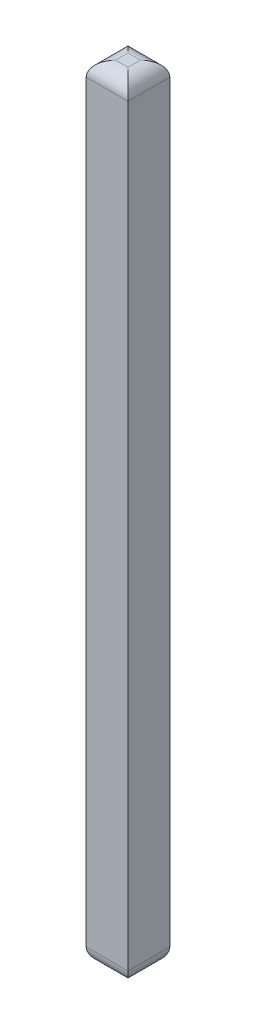
ISO-10303-21;
HEADER;
FILE_DESCRIPTION(('STEP AP214'),'2;1');
FILE_NAME('part.step','',(''),(''),'','','');
FILE_SCHEMA(('AUTOMOTIVE_DESIGN { 1 0 10303 214 1 1 1 1 }'));
ENDSEC;
DATA;
#1=APPLICATION_CONTEXT('core data for automotive mechanical design processes');
#2=APPLICATION_PROTOCOL_DEFINITION('international standard','automotive_design',2000,#1);
#3=PRODUCT_CONTEXT('',#1,'mechanical');
#4=PRODUCT('Part','Part','',(#3));
#5=PRODUCT_RELATED_PRODUCT_CATEGORY('part','',(#4));
#6=PRODUCT_DEFINITION_FORMATION('','',#4);
#7=PRODUCT_DEFINITION_CONTEXT('part definition',#1,'design');
#8=PRODUCT_DEFINITION('design','',#6,#7);
#9=PRODUCT_DEFINITION_SHAPE('','',#8);
#10=(LENGTH_UNIT() NAMED_UNIT(*) SI_UNIT(.MILLI.,.METRE.));
#11=(NAMED_UNIT(*) PLANE_ANGLE_UNIT() SI_UNIT($,.RADIAN.));
#12=(NAMED_UNIT(*) SI_UNIT($,.STERADIAN.) SOLID_ANGLE_UNIT());
#13=UNCERTAINTY_MEASURE_WITH_UNIT(LENGTH_MEASURE(1.E-05),#10,'distance_accuracy_value','');
#14=(GEOMETRIC_REPRESENTATION_CONTEXT(3) GLOBAL_UNCERTAINTY_ASSIGNED_CONTEXT((#13)) GLOBAL_UNIT_ASSIGNED_CONTEXT((#10,
#11,#12)) REPRESENTATION_CONTEXT('',''));
#15=CARTESIAN_POINT('',(0.,0.,0.));
#16=DIRECTION('',(0.,0.,1.));
#17=DIRECTION('',(1.,0.,0.));
#18=AXIS2_PLACEMENT_3D('',#15,#16,#17);
#19=CARTESIAN_POINT('',(-0.32,19.9800966799188,0.32));
#20=DIRECTION('',(0.,0.,-1.));
#21=DIRECTION('',(0.,-1.,0.));
#22=AXIS2_PLACEMENT_3D('',#19,#20,#21);
#23=PLANE('',#22);
#24=DIRECTION('',(0.,-1.,0.));
#25=VECTOR('',#24,1.);
#26=CARTESIAN_POINT('',(0.32,19.9800966799188,0.32));
#27=LINE('',#26,#25);
#28=CARTESIAN_POINT('',(0.32,11.23,0.32));
#29=VERTEX_POINT('',#28);
#30=CARTESIAN_POINT('',(0.32,-0.305,0.32));
#31=VERTEX_POINT('',#30);
#32=EDGE_CURVE('E39',#29,#31,#27,.T.);
#33=ORIENTED_EDGE('',*,*,#32,.F.);
#34=DIRECTION('',(-1.,0.,0.));
#35=VECTOR('',#34,1.);
#36=CARTESIAN_POINT('',(-0.32,11.23,0.32));
#37=LINE('',#36,#35);
#38=CARTESIAN_POINT('',(-0.32,11.23,0.32));
#39=VERTEX_POINT('',#38);
#40=EDGE_CURVE('E11',#29,#39,#37,.T.);
#41=ORIENTED_EDGE('',*,*,#40,.T.);
#42=DIRECTION('',(0.,-1.,0.));
#43=VECTOR('',#42,1.);
#44=CARTESIAN_POINT('',(-0.32,19.9800966799188,0.32));
#45=LINE('',#44,#43);
#46=CARTESIAN_POINT('',(-0.32,-0.305,0.32));
#47=VERTEX_POINT('',#46);
#48=EDGE_CURVE('E27',#39,#47,#45,.T.);
#49=ORIENTED_EDGE('',*,*,#48,.T.);
#50=DIRECTION('',(1.,0.,0.));
#51=VECTOR('',#50,1.);
#52=CARTESIAN_POINT('',(0.32,-0.305,0.32));
#53=LINE('',#52,#51);
#54=EDGE_CURVE('E155',#47,#31,#53,.T.);
#55=ORIENTED_EDGE('',*,*,#54,.T.);
#56=EDGE_LOOP('',(#33,#41,#49,#55));
#57=FACE_BOUND('',#56,.T.);
#58=ADVANCED_FACE('F16',(#57),#23,.F.);
#59=CARTESIAN_POINT('',(-0.32,19.9800966799188,0.32));
#60=DIRECTION('',(1.,0.,0.));
#61=DIRECTION('',(0.,1.,0.));
#62=AXIS2_PLACEMENT_3D('',#59,#60,#61);
#63=PLANE('',#62);
#64=ORIENTED_EDGE('',*,*,#48,.F.);
#65=DIRECTION('',(0.,0.,-1.));
#66=VECTOR('',#65,1.);
#67=CARTESIAN_POINT('',(-0.32,11.23,0.32));
#68=LINE('',#67,#66);
#69=CARTESIAN_POINT('',(-0.32,11.23,-0.32));
#70=VERTEX_POINT('',#69);
#71=EDGE_CURVE('E160',#39,#70,#68,.T.);
#72=ORIENTED_EDGE('',*,*,#71,.T.);
#73=DIRECTION('',(0.,-1.,0.));
#74=VECTOR('',#73,1.);
#75=CARTESIAN_POINT('',(-0.32,19.9800966799188,-0.32));
#76=LINE('',#75,#74);
#77=CARTESIAN_POINT('',(-0.32,-0.305,-0.32));
#78=VERTEX_POINT('',#77);
#79=EDGE_CURVE('E125',#70,#78,#76,.T.);
#80=ORIENTED_EDGE('',*,*,#79,.T.);
#81=DIRECTION('',(0.,0.,1.));
#82=VECTOR('',#81,1.);
#83=CARTESIAN_POINT('',(-0.32,-0.305,0.32));
#84=LINE('',#83,#82);
#85=EDGE_CURVE('E130',#78,#47,#84,.T.);
#86=ORIENTED_EDGE('',*,*,#85,.T.);
#87=EDGE_LOOP('',(#64,#72,#80,#86));
#88=FACE_BOUND('',#87,.T.);
#89=ADVANCED_FACE('F357',(#88),#63,.F.);
#90=CARTESIAN_POINT('',(-0.32,19.9800966799188,-0.32));
#91=DIRECTION('',(0.,0.,1.));
#92=DIRECTION('',(1.,0.,0.));
#93=AXIS2_PLACEMENT_3D('',#90,#91,#92);
#94=PLANE('',#93);
#95=ORIENTED_EDGE('',*,*,#79,.F.);
#96=DIRECTION('',(1.,0.,0.));
#97=VECTOR('',#96,1.);
#98=CARTESIAN_POINT('',(-0.32,11.23,-0.32));
#99=LINE('',#98,#97);
#100=CARTESIAN_POINT('',(0.32,11.23,-0.32));
#101=VERTEX_POINT('',#100);
#102=EDGE_CURVE('E120',#70,#101,#99,.T.);
#103=ORIENTED_EDGE('',*,*,#102,.T.);
#104=DIRECTION('',(0.,-1.,0.));
#105=VECTOR('',#104,1.);
#106=CARTESIAN_POINT('',(0.32,19.9800966799188,-0.32));
#107=LINE('',#106,#105);
#108=CARTESIAN_POINT('',(0.32,-0.305,-0.32));
#109=VERTEX_POINT('',#108);
#110=EDGE_CURVE('E112',#101,#109,#107,.T.);
#111=ORIENTED_EDGE('',*,*,#110,.T.);
#112=DIRECTION('',(-1.,0.,0.));
#113=VECTOR('',#112,1.);
#114=CARTESIAN_POINT('',(-0.32,-0.305,-0.32));
#115=LINE('',#114,#113);
#116=EDGE_CURVE('E110',#109,#78,#115,.T.);
#117=ORIENTED_EDGE('',*,*,#116,.T.);
#118=EDGE_LOOP('',(#95,#103,#111,#117));
#119=FACE_BOUND('',#118,.T.);
#120=ADVANCED_FACE('F123',(#119),#94,.F.);
#121=CARTESIAN_POINT('',(0.32,19.9800966799188,0.32));
#122=DIRECTION('',(-1.,0.,0.));
#123=DIRECTION('',(0.,0.,1.));
#124=AXIS2_PLACEMENT_3D('',#121,#122,#123);
#125=PLANE('',#124);
#126=ORIENTED_EDGE('',*,*,#110,.F.);
#127=DIRECTION('',(0.,0.,1.));
#128=VECTOR('',#127,1.);
#129=CARTESIAN_POINT('',(0.32,11.23,0.32));
#130=LINE('',#129,#128);
#131=EDGE_CURVE('E20',#101,#29,#130,.T.);
#132=ORIENTED_EDGE('',*,*,#131,.T.);
#133=ORIENTED_EDGE('',*,*,#32,.T.);
#134=DIRECTION('',(0.,0.,-1.));
#135=VECTOR('',#134,1.);
#136=CARTESIAN_POINT('',(0.32,-0.305,-0.32));
#137=LINE('',#136,#135);
#138=EDGE_CURVE('E115',#31,#109,#137,.T.);
#139=ORIENTED_EDGE('',*,*,#138,.T.);
#140=EDGE_LOOP('',(#126,#132,#133,#139));
#141=FACE_BOUND('',#140,.T.);
#142=ADVANCED_FACE('F114',(#141),#125,.F.);
#143=CARTESIAN_POINT('',(0.,11.455,0.));
#144=DIRECTION('',(0.,-1.,0.));
#145=DIRECTION('',(0.,0.,-1.));
#146=AXIS2_PLACEMENT_3D('',#143,#144,#145);
#147=PLANE('',#146);
#148=DIRECTION('',(1.,0.,0.));
#149=VECTOR('',#148,1.);
#150=CARTESIAN_POINT('',(0.,11.455,0.095));
#151=LINE('',#150,#149);
#152=CARTESIAN_POINT('',(-0.095,11.455,0.095));
#153=VERTEX_POINT('',#152);
#154=CARTESIAN_POINT('',(0.095,11.455,0.095));
#155=VERTEX_POINT('',#154);
#156=EDGE_CURVE('E211',#153,#155,#151,.T.);
#157=ORIENTED_EDGE('',*,*,#156,.T.);
#158=DIRECTION('',(0.,0.,-1.));
#159=VECTOR('',#158,1.);
#160=CARTESIAN_POINT('',(0.095,11.455,0.));
#161=LINE('',#160,#159);
#162=CARTESIAN_POINT('',(0.095,11.455,-0.095));
#163=VERTEX_POINT('',#162);
#164=EDGE_CURVE('E153',#155,#163,#161,.T.);
#165=ORIENTED_EDGE('',*,*,#164,.T.);
#166=DIRECTION('',(-1.,0.,0.));
#167=VECTOR('',#166,1.);
#168=CARTESIAN_POINT('',(0.,11.455,-0.095));
#169=LINE('',#168,#167);
#170=CARTESIAN_POINT('',(-0.095,11.455,-0.095));
#171=VERTEX_POINT('',#170);
#172=EDGE_CURVE('E134',#163,#171,#169,.T.);
#173=ORIENTED_EDGE('',*,*,#172,.T.);
#174=DIRECTION('',(0.,0.,1.));
#175=VECTOR('',#174,1.);
#176=CARTESIAN_POINT('',(-0.095,11.455,0.));
#177=LINE('',#176,#175);
#178=EDGE_CURVE('E184',#171,#153,#177,.T.);
#179=ORIENTED_EDGE('',*,*,#178,.T.);
#180=EDGE_LOOP('',(#157,#165,#173,#179));
#181=FACE_BOUND('',#180,.T.);
#182=ADVANCED_FACE('F274',(#181),#147,.F.);
#183=CARTESIAN_POINT('',(0.,-0.53,0.));
#184=DIRECTION('',(0.,-1.,0.));
#185=DIRECTION('',(0.,0.,-1.));
#186=AXIS2_PLACEMENT_3D('',#183,#184,#185);
#187=PLANE('',#186);
#188=DIRECTION('',(0.,0.,-1.));
#189=VECTOR('',#188,1.);
#190=CARTESIAN_POINT('',(-0.095,-0.53,-0.32));
#191=LINE('',#190,#189);
#192=CARTESIAN_POINT('',(-0.095,-0.53,0.095));
#193=VERTEX_POINT('',#192);
#194=CARTESIAN_POINT('',(-0.095,-0.53,-0.095));
#195=VERTEX_POINT('',#194);
#196=EDGE_CURVE('E186',#193,#195,#191,.T.);
#197=ORIENTED_EDGE('',*,*,#196,.T.);
#198=DIRECTION('',(1.,0.,0.));
#199=VECTOR('',#198,1.);
#200=CARTESIAN_POINT('',(0.32,-0.53,-0.095));
#201=LINE('',#200,#199);
#202=CARTESIAN_POINT('',(0.095,-0.53,-0.095));
#203=VERTEX_POINT('',#202);
#204=EDGE_CURVE('E215',#195,#203,#201,.T.);
#205=ORIENTED_EDGE('',*,*,#204,.T.);
#206=DIRECTION('',(0.,0.,1.));
#207=VECTOR('',#206,1.);
#208=CARTESIAN_POINT('',(0.095,-0.53,0.32));
#209=LINE('',#208,#207);
#210=CARTESIAN_POINT('',(0.095,-0.53,0.095));
#211=VERTEX_POINT('',#210);
#212=EDGE_CURVE('E183',#203,#211,#209,.T.);
#213=ORIENTED_EDGE('',*,*,#212,.T.);
#214=DIRECTION('',(-1.,0.,0.));
#215=VECTOR('',#214,1.);
#216=CARTESIAN_POINT('',(-0.32,-0.53,0.095));
#217=LINE('',#216,#215);
#218=EDGE_CURVE('E180',#211,#193,#217,.T.);
#219=ORIENTED_EDGE('',*,*,#218,.T.);
#220=EDGE_LOOP('',(#197,#205,#213,#219));
#221=FACE_BOUND('',#220,.T.);
#222=ADVANCED_FACE('F229',(#221),#187,.T.);
#223=CARTESIAN_POINT('',(-0.095,11.23,0.32));
#224=DIRECTION('',(0.,0.,-1.));
#225=DIRECTION('',(-1.,0.,0.));
#226=AXIS2_PLACEMENT_3D('',#223,#224,#225);
#227=CYLINDRICAL_SURFACE('',#226,0.225);
#228=CARTESIAN_POINT('',(-0.095,11.455,0.095));
#229=CARTESIAN_POINT('',(-0.226801948466054,11.455,0.226801948466054));
#230=CARTESIAN_POINT('',(-0.32,11.3618019484661,0.32));
#231=CARTESIAN_POINT('',(-0.32,11.23,0.32));
#232=(BOUNDED_CURVE() B_SPLINE_CURVE(3,(#228,#229,#230,#231),.UNSPECIFIED.,.F.,
.F.) B_SPLINE_CURVE_WITH_KNOTS((4,4),(1.5707963267949,3.1415926535898),
.UNSPECIFIED.) CURVE() GEOMETRIC_REPRESENTATION_ITEM() RATIONAL_B_SPLINE_CURVE((1.,
0.804737854124365,0.804737854124365,1.)) REPRESENTATION_ITEM(''));
#233=EDGE_CURVE('E137',#153,#39,#232,.T.);
#234=ORIENTED_EDGE('',*,*,#233,.F.);
#235=ORIENTED_EDGE('',*,*,#178,.F.);
#236=CARTESIAN_POINT('',(-0.32,11.23,-0.32));
#237=CARTESIAN_POINT('',(-0.32,11.3618019484661,-0.32));
#238=CARTESIAN_POINT('',(-0.226801948466054,11.455,-0.226801948466054));
#239=CARTESIAN_POINT('',(-0.095,11.455,-0.095));
#240=(BOUNDED_CURVE() B_SPLINE_CURVE(3,(#236,#237,#238,#239),.UNSPECIFIED.,.F.,
.F.) B_SPLINE_CURVE_WITH_KNOTS((4,4),(3.1415926535898,4.71238898038469),
.UNSPECIFIED.) CURVE() GEOMETRIC_REPRESENTATION_ITEM() RATIONAL_B_SPLINE_CURVE((1.,
0.804737854124365,0.804737854124365,1.)) REPRESENTATION_ITEM(''));
#241=EDGE_CURVE('E145',#70,#171,#240,.T.);
#242=ORIENTED_EDGE('',*,*,#241,.F.);
#243=ORIENTED_EDGE('',*,*,#71,.F.);
#244=EDGE_LOOP('',(#234,#235,#242,#243));
#245=FACE_BOUND('',#244,.T.);
#246=ADVANCED_FACE('F271',(#245),#227,.T.);
#247=CARTESIAN_POINT('',(-0.32,11.23,-0.095));
#248=DIRECTION('',(1.,0.,0.));
#249=DIRECTION('',(0.,0.,-1.));
#250=AXIS2_PLACEMENT_3D('',#247,#248,#249);
#251=CYLINDRICAL_SURFACE('',#250,0.225);
#252=ORIENTED_EDGE('',*,*,#241,.T.);
#253=ORIENTED_EDGE('',*,*,#172,.F.);
#254=CARTESIAN_POINT('',(0.32,11.23,-0.32));
#255=CARTESIAN_POINT('',(0.32,11.3618019484661,-0.32));
#256=CARTESIAN_POINT('',(0.226801948466054,11.455,-0.226801948466054));
#257=CARTESIAN_POINT('',(0.095,11.455,-0.095));
#258=(BOUNDED_CURVE() B_SPLINE_CURVE(3,(#254,#255,#256,#257),.UNSPECIFIED.,.F.,
.F.) B_SPLINE_CURVE_WITH_KNOTS((4,4),(0.,1.5707963267949),
.UNSPECIFIED.) CURVE() GEOMETRIC_REPRESENTATION_ITEM() RATIONAL_B_SPLINE_CURVE((1.,
0.804737854124365,0.804737854124365,1.)) REPRESENTATION_ITEM(''));
#259=EDGE_CURVE('E104',#101,#163,#258,.T.);
#260=ORIENTED_EDGE('',*,*,#259,.F.);
#261=ORIENTED_EDGE('',*,*,#102,.F.);
#262=EDGE_LOOP('',(#252,#253,#260,#261));
#263=FACE_BOUND('',#262,.T.);
#264=ADVANCED_FACE('F132',(#263),#251,.T.);
#265=CARTESIAN_POINT('',(-0.32,11.23,0.095));
#266=DIRECTION('',(-1.,0.,0.));
#267=DIRECTION('',(0.,0.,1.));
#268=AXIS2_PLACEMENT_3D('',#265,#266,#267);
#269=CYLINDRICAL_SURFACE('',#268,0.225);
#270=ORIENTED_EDGE('',*,*,#233,.T.);
#271=ORIENTED_EDGE('',*,*,#40,.F.);
#272=CARTESIAN_POINT('',(0.095,11.455,0.095));
#273=CARTESIAN_POINT('',(0.226801948466054,11.455,0.226801948466054));
#274=CARTESIAN_POINT('',(0.32,11.3618019484661,0.32));
#275=CARTESIAN_POINT('',(0.32,11.23,0.32));
#276=(BOUNDED_CURVE() B_SPLINE_CURVE(3,(#272,#273,#274,#275),.UNSPECIFIED.,.F.,
.F.) B_SPLINE_CURVE_WITH_KNOTS((4,4),(1.5707963267949,3.1415926535898),
.UNSPECIFIED.) CURVE() GEOMETRIC_REPRESENTATION_ITEM() RATIONAL_B_SPLINE_CURVE((1.,
0.804737854124365,0.804737854124365,1.)) REPRESENTATION_ITEM(''));
#277=EDGE_CURVE('E106',#155,#29,#276,.T.);
#278=ORIENTED_EDGE('',*,*,#277,.F.);
#279=ORIENTED_EDGE('',*,*,#156,.F.);
#280=EDGE_LOOP('',(#270,#271,#278,#279));
#281=FACE_BOUND('',#280,.T.);
#282=ADVANCED_FACE('F376',(#281),#269,.T.);
#283=CARTESIAN_POINT('',(0.095,11.23,0.32));
#284=DIRECTION('',(0.,0.,1.));
#285=DIRECTION('',(1.,0.,0.));
#286=AXIS2_PLACEMENT_3D('',#283,#284,#285);
#287=CYLINDRICAL_SURFACE('',#286,0.225);
#288=ORIENTED_EDGE('',*,*,#259,.T.);
#289=ORIENTED_EDGE('',*,*,#164,.F.);
#290=ORIENTED_EDGE('',*,*,#277,.T.);
#291=ORIENTED_EDGE('',*,*,#131,.F.);
#292=EDGE_LOOP('',(#288,#289,#290,#291));
#293=FACE_BOUND('',#292,.T.);
#294=ADVANCED_FACE('F101',(#293),#287,.T.);
#295=CARTESIAN_POINT('',(-0.32,-0.305,0.095));
#296=DIRECTION('',(-1.,0.,0.));
#297=DIRECTION('',(0.,0.,1.));
#298=AXIS2_PLACEMENT_3D('',#295,#296,#297);
#299=CYLINDRICAL_SURFACE('',#298,0.225);
#300=CARTESIAN_POINT('',(-0.095,-0.53,0.095));
#301=CARTESIAN_POINT('',(-0.226801948466054,-0.530000000000003,0.226801948466054));
#302=CARTESIAN_POINT('',(-0.32,-0.436801948466057,0.32));
#303=CARTESIAN_POINT('',(-0.32,-0.305,0.32));
#304=(BOUNDED_CURVE() B_SPLINE_CURVE(3,(#300,#301,#302,#303),.UNSPECIFIED.,.F.,
.F.) B_SPLINE_CURVE_WITH_KNOTS((4,4),(4.71238898038469,6.28318530717959),
.UNSPECIFIED.) CURVE() GEOMETRIC_REPRESENTATION_ITEM() RATIONAL_B_SPLINE_CURVE((1.,
0.804737854124365,0.804737854124365,1.)) REPRESENTATION_ITEM(''));
#305=EDGE_CURVE('E200',#193,#47,#304,.T.);
#306=ORIENTED_EDGE('',*,*,#305,.F.);
#307=ORIENTED_EDGE('',*,*,#218,.F.);
#308=CARTESIAN_POINT('',(0.32,-0.305,0.32));
#309=CARTESIAN_POINT('',(0.32,-0.436801948466057,0.32));
#310=CARTESIAN_POINT('',(0.226801948466054,-0.530000000000003,0.226801948466054));
#311=CARTESIAN_POINT('',(0.095,-0.53,0.095));
#312=(BOUNDED_CURVE() B_SPLINE_CURVE(3,(#308,#309,#310,#311),.UNSPECIFIED.,.F.,
.F.) B_SPLINE_CURVE_WITH_KNOTS((4,4),(0.,1.5707963267949),
.UNSPECIFIED.) CURVE() GEOMETRIC_REPRESENTATION_ITEM() RATIONAL_B_SPLINE_CURVE((1.,
0.804737854124365,0.804737854124365,1.)) REPRESENTATION_ITEM(''));
#313=EDGE_CURVE('E147',#31,#211,#312,.T.);
#314=ORIENTED_EDGE('',*,*,#313,.F.);
#315=ORIENTED_EDGE('',*,*,#54,.F.);
#316=EDGE_LOOP('',(#306,#307,#314,#315));
#317=FACE_BOUND('',#316,.T.);
#318=ADVANCED_FACE('F375',(#317),#299,.T.);
#319=CARTESIAN_POINT('',(0.095,-0.305,0.32));
#320=DIRECTION('',(0.,0.,1.));
#321=DIRECTION('',(1.,0.,0.));
#322=AXIS2_PLACEMENT_3D('',#319,#320,#321);
#323=CYLINDRICAL_SURFACE('',#322,0.225);
#324=ORIENTED_EDGE('',*,*,#313,.T.);
#325=ORIENTED_EDGE('',*,*,#212,.F.);
#326=CARTESIAN_POINT('',(0.32,-0.305,-0.32));
#327=CARTESIAN_POINT('',(0.32,-0.436801948466057,-0.32));
#328=CARTESIAN_POINT('',(0.226801948466054,-0.530000000000003,-0.226801948466054));
#329=CARTESIAN_POINT('',(0.095,-0.53,-0.095));
#330=(BOUNDED_CURVE() B_SPLINE_CURVE(3,(#326,#327,#328,#329),.UNSPECIFIED.,.F.,
.F.) B_SPLINE_CURVE_WITH_KNOTS((4,4),(3.1415926535898,4.71238898038469),
.UNSPECIFIED.) CURVE() GEOMETRIC_REPRESENTATION_ITEM() RATIONAL_B_SPLINE_CURVE((1.,
0.804737854124365,0.804737854124365,1.)) REPRESENTATION_ITEM(''));
#331=EDGE_CURVE('E194',#109,#203,#330,.T.);
#332=ORIENTED_EDGE('',*,*,#331,.F.);
#333=ORIENTED_EDGE('',*,*,#138,.F.);
#334=EDGE_LOOP('',(#324,#325,#332,#333));
#335=FACE_BOUND('',#334,.T.);
#336=ADVANCED_FACE('F233',(#335),#323,.T.);
#337=CARTESIAN_POINT('',(-0.095,-0.305,0.32));
#338=DIRECTION('',(0.,0.,-1.));
#339=DIRECTION('',(-1.,0.,0.));
#340=AXIS2_PLACEMENT_3D('',#337,#338,#339);
#341=CYLINDRICAL_SURFACE('',#340,0.225);
#342=ORIENTED_EDGE('',*,*,#305,.T.);
#343=ORIENTED_EDGE('',*,*,#85,.F.);
#344=CARTESIAN_POINT('',(-0.095,-0.53,-0.095));
#345=CARTESIAN_POINT('',(-0.226801948466054,-0.530000000000003,-0.226801948466054));
#346=CARTESIAN_POINT('',(-0.32,-0.436801948466057,-0.32));
#347=CARTESIAN_POINT('',(-0.32,-0.305,-0.32));
#348=(BOUNDED_CURVE() B_SPLINE_CURVE(3,(#344,#345,#346,#347),.UNSPECIFIED.,.F.,
.F.) B_SPLINE_CURVE_WITH_KNOTS((4,4),(4.71238898038469,6.28318530717959),
.UNSPECIFIED.) CURVE() GEOMETRIC_REPRESENTATION_ITEM() RATIONAL_B_SPLINE_CURVE((1.,
0.804737854124365,0.804737854124365,1.)) REPRESENTATION_ITEM(''));
#349=EDGE_CURVE('E188',#195,#78,#348,.T.);
#350=ORIENTED_EDGE('',*,*,#349,.F.);
#351=ORIENTED_EDGE('',*,*,#196,.F.);
#352=EDGE_LOOP('',(#342,#343,#350,#351));
#353=FACE_BOUND('',#352,.T.);
#354=ADVANCED_FACE('F344',(#353),#341,.T.);
#355=CARTESIAN_POINT('',(-0.32,-0.305,-0.095));
#356=DIRECTION('',(1.,0.,0.));
#357=DIRECTION('',(0.,0.,-1.));
#358=AXIS2_PLACEMENT_3D('',#355,#356,#357);
#359=CYLINDRICAL_SURFACE('',#358,0.225);
#360=ORIENTED_EDGE('',*,*,#331,.T.);
#361=ORIENTED_EDGE('',*,*,#204,.F.);
#362=ORIENTED_EDGE('',*,*,#349,.T.);
#363=ORIENTED_EDGE('',*,*,#116,.F.);
#364=EDGE_LOOP('',(#360,#361,#362,#363));
#365=FACE_BOUND('',#364,.T.);
#366=ADVANCED_FACE('F18',(#365),#359,.T.);
#367=CLOSED_SHELL('',(#58,#89,#120,#142,#182,#222,#246,#264,#282,#294,#318,#336,#354,#366));
#368=MANIFOLD_SOLID_BREP('B1',#367);
#369=ADVANCED_BREP_SHAPE_REPRESENTATION('',(#18,#368),#14);
#370=SHAPE_DEFINITION_REPRESENTATION(#9,#369);
ENDSEC;
END-ISO-10303-21;
